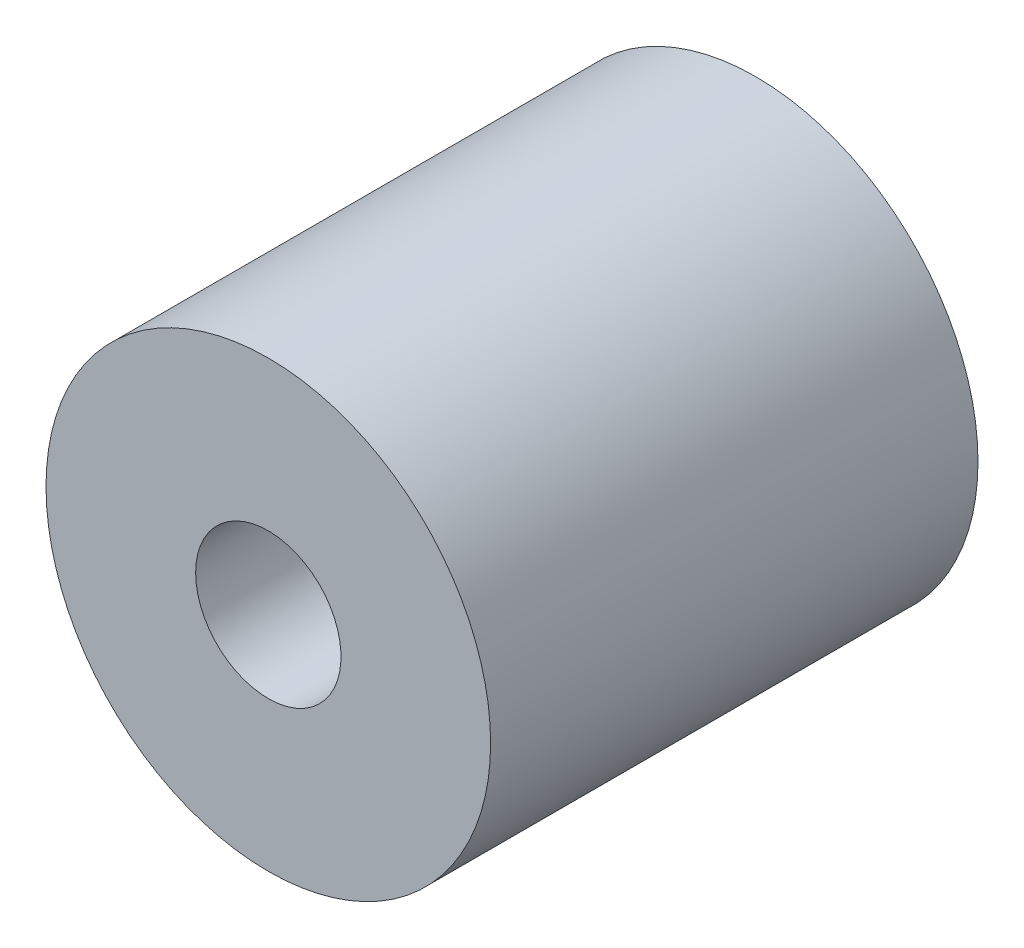
ISO-10303-21;
HEADER;
FILE_DESCRIPTION(('STEP AP214'),'2;1');
FILE_NAME('part.step','',(''),(''),'','','');
FILE_SCHEMA(('AUTOMOTIVE_DESIGN { 1 0 10303 214 1 1 1 1 }'));
ENDSEC;
DATA;
#1=APPLICATION_CONTEXT('core data for automotive mechanical design processes');
#2=APPLICATION_PROTOCOL_DEFINITION('international standard','automotive_design',2000,#1);
#3=PRODUCT_CONTEXT('',#1,'mechanical');
#4=PRODUCT('Part','Part','',(#3));
#5=PRODUCT_RELATED_PRODUCT_CATEGORY('part','',(#4));
#6=PRODUCT_DEFINITION_FORMATION('','',#4);
#7=PRODUCT_DEFINITION_CONTEXT('part definition',#1,'design');
#8=PRODUCT_DEFINITION('design','',#6,#7);
#9=PRODUCT_DEFINITION_SHAPE('','',#8);
#10=(LENGTH_UNIT() NAMED_UNIT(*) SI_UNIT(.MILLI.,.METRE.));
#11=(NAMED_UNIT(*) PLANE_ANGLE_UNIT() SI_UNIT($,.RADIAN.));
#12=(NAMED_UNIT(*) SI_UNIT($,.STERADIAN.) SOLID_ANGLE_UNIT());
#13=UNCERTAINTY_MEASURE_WITH_UNIT(LENGTH_MEASURE(1.E-05),#10,'distance_accuracy_value','');
#14=(GEOMETRIC_REPRESENTATION_CONTEXT(3) GLOBAL_UNCERTAINTY_ASSIGNED_CONTEXT((#13)) GLOBAL_UNIT_ASSIGNED_CONTEXT((#10,
#11,#12)) REPRESENTATION_CONTEXT('',''));
#15=CARTESIAN_POINT('',(0.,0.,0.));
#16=DIRECTION('',(0.,0.,1.));
#17=DIRECTION('',(1.,0.,0.));
#18=AXIS2_PLACEMENT_3D('',#15,#16,#17);
#19=CARTESIAN_POINT('',(0.,0.,57.));
#20=DIRECTION('',(0.,0.,1.));
#21=DIRECTION('',(1.,0.,0.));
#22=AXIS2_PLACEMENT_3D('',#19,#20,#21);
#23=PLANE('',#22);
#24=CARTESIAN_POINT('',(0.,0.,57.));
#25=DIRECTION('',(0.,0.,1.));
#26=DIRECTION('',(1.,0.,0.));
#27=AXIS2_PLACEMENT_3D('',#24,#25,#26);
#28=CIRCLE('',#27,26.);
#29=CARTESIAN_POINT('',(-26.,0.,57.));
#30=VERTEX_POINT('',#29);
#31=EDGE_CURVE('E10',#30,#30,#28,.T.);
#32=ORIENTED_EDGE('',*,*,#31,.T.);
#33=EDGE_LOOP('',(#32));
#34=FACE_BOUND('',#33,.T.);
#35=CARTESIAN_POINT('',(0.,0.,57.));
#36=DIRECTION('',(0.,0.,1.));
#37=DIRECTION('',(1.,0.,0.));
#38=AXIS2_PLACEMENT_3D('',#35,#36,#37);
#39=CIRCLE('',#38,8.5);
#40=CARTESIAN_POINT('',(-8.5,0.,57.));
#41=VERTEX_POINT('',#40);
#42=EDGE_CURVE('E42',#41,#41,#39,.T.);
#43=ORIENTED_EDGE('',*,*,#42,.F.);
#44=EDGE_LOOP('',(#43));
#45=FACE_BOUND('',#44,.T.);
#46=ADVANCED_FACE('F31',(#34,#45),#23,.T.);
#47=CARTESIAN_POINT('',(0.,0.,0.));
#48=DIRECTION('',(0.,0.,1.));
#49=DIRECTION('',(1.,0.,0.));
#50=AXIS2_PLACEMENT_3D('',#47,#48,#49);
#51=PLANE('',#50);
#52=CARTESIAN_POINT('',(0.,0.,0.));
#53=DIRECTION('',(0.,0.,1.));
#54=DIRECTION('',(1.,0.,0.));
#55=AXIS2_PLACEMENT_3D('',#52,#53,#54);
#56=CIRCLE('',#55,26.);
#57=CARTESIAN_POINT('',(-26.,0.,0.));
#58=VERTEX_POINT('',#57);
#59=EDGE_CURVE('E35',#58,#58,#56,.T.);
#60=ORIENTED_EDGE('',*,*,#59,.F.);
#61=EDGE_LOOP('',(#60));
#62=FACE_BOUND('',#61,.T.);
#63=CARTESIAN_POINT('',(0.,0.,0.));
#64=DIRECTION('',(0.,0.,1.));
#65=DIRECTION('',(1.,0.,0.));
#66=AXIS2_PLACEMENT_3D('',#63,#64,#65);
#67=CIRCLE('',#66,8.5);
#68=CARTESIAN_POINT('',(-8.5,0.,0.));
#69=VERTEX_POINT('',#68);
#70=EDGE_CURVE('E44',#69,#69,#67,.T.);
#71=ORIENTED_EDGE('',*,*,#70,.T.);
#72=EDGE_LOOP('',(#71));
#73=FACE_BOUND('',#72,.T.);
#74=ADVANCED_FACE('F54',(#62,#73),#51,.F.);
#75=CARTESIAN_POINT('',(0.,0.,57.));
#76=DIRECTION('',(0.,0.,-1.));
#77=DIRECTION('',(-1.,0.,0.));
#78=AXIS2_PLACEMENT_3D('',#75,#76,#77);
#79=CYLINDRICAL_SURFACE('',#78,26.);
#80=CARTESIAN_POINT('',(-26.,0.,57.));
#81=CARTESIAN_POINT('',(-26.,0.,56.40625));
#82=CARTESIAN_POINT('',(-26.,0.,55.8125));
#83=CARTESIAN_POINT('',(-26.,0.,54.625));
#84=CARTESIAN_POINT('',(-26.,0.,54.03125));
#85=CARTESIAN_POINT('',(-26.,0.,52.84375));
#86=CARTESIAN_POINT('',(-26.,0.,52.25));
#87=CARTESIAN_POINT('',(-26.,0.,51.0625));
#88=CARTESIAN_POINT('',(-26.,0.,50.46875));
#89=CARTESIAN_POINT('',(-26.,0.,49.28125));
#90=CARTESIAN_POINT('',(-26.,0.,48.6875));
#91=CARTESIAN_POINT('',(-26.,0.,47.5));
#92=CARTESIAN_POINT('',(-26.,0.,46.90625));
#93=CARTESIAN_POINT('',(-26.,0.,45.71875));
#94=CARTESIAN_POINT('',(-26.,0.,45.125));
#95=CARTESIAN_POINT('',(-26.,0.,43.9375));
#96=CARTESIAN_POINT('',(-26.,0.,43.34375));
#97=CARTESIAN_POINT('',(-26.,0.,42.15625));
#98=CARTESIAN_POINT('',(-26.,0.,41.5625));
#99=CARTESIAN_POINT('',(-26.,0.,40.375));
#100=CARTESIAN_POINT('',(-26.,0.,39.78125));
#101=CARTESIAN_POINT('',(-26.,0.,38.59375));
#102=CARTESIAN_POINT('',(-26.,0.,38.));
#103=CARTESIAN_POINT('',(-26.,0.,36.8125));
#104=CARTESIAN_POINT('',(-26.,0.,36.21875));
#105=CARTESIAN_POINT('',(-26.,0.,35.03125));
#106=CARTESIAN_POINT('',(-26.,0.,34.4375));
#107=CARTESIAN_POINT('',(-26.,0.,33.25));
#108=CARTESIAN_POINT('',(-26.,0.,32.65625));
#109=CARTESIAN_POINT('',(-26.,0.,31.46875));
#110=CARTESIAN_POINT('',(-26.,0.,30.875));
#111=CARTESIAN_POINT('',(-26.,0.,29.6875));
#112=CARTESIAN_POINT('',(-26.,0.,29.09375));
#113=CARTESIAN_POINT('',(-26.,0.,27.90625));
#114=CARTESIAN_POINT('',(-26.,0.,27.3125));
#115=CARTESIAN_POINT('',(-26.,0.,26.125));
#116=CARTESIAN_POINT('',(-26.,0.,25.53125));
#117=CARTESIAN_POINT('',(-26.,0.,24.34375));
#118=CARTESIAN_POINT('',(-26.,0.,23.75));
#119=CARTESIAN_POINT('',(-26.,0.,22.5625));
#120=CARTESIAN_POINT('',(-26.,0.,21.96875));
#121=CARTESIAN_POINT('',(-26.,0.,20.78125));
#122=CARTESIAN_POINT('',(-26.,0.,20.1875));
#123=CARTESIAN_POINT('',(-26.,0.,19.));
#124=CARTESIAN_POINT('',(-26.,0.,18.40625));
#125=CARTESIAN_POINT('',(-26.,0.,17.21875));
#126=CARTESIAN_POINT('',(-26.,0.,16.625));
#127=CARTESIAN_POINT('',(-26.,0.,15.4375));
#128=CARTESIAN_POINT('',(-26.,0.,14.84375));
#129=CARTESIAN_POINT('',(-26.,0.,13.65625));
#130=CARTESIAN_POINT('',(-26.,0.,13.0625));
#131=CARTESIAN_POINT('',(-26.,0.,11.875));
#132=CARTESIAN_POINT('',(-26.,0.,11.28125));
#133=CARTESIAN_POINT('',(-26.,0.,10.09375));
#134=CARTESIAN_POINT('',(-26.,0.,9.5));
#135=CARTESIAN_POINT('',(-26.,0.,8.3125));
#136=CARTESIAN_POINT('',(-26.,0.,7.71875));
#137=CARTESIAN_POINT('',(-26.,0.,6.53125));
#138=CARTESIAN_POINT('',(-26.,0.,5.9375));
#139=CARTESIAN_POINT('',(-26.,0.,4.75));
#140=CARTESIAN_POINT('',(-26.,0.,4.15625));
#141=CARTESIAN_POINT('',(-26.,0.,2.96875));
#142=CARTESIAN_POINT('',(-26.,0.,2.375));
#143=CARTESIAN_POINT('',(-26.,0.,1.1875));
#144=CARTESIAN_POINT('',(-26.,0.,0.593749999999999));
#145=CARTESIAN_POINT('',(-26.,0.,0.));
#146=B_SPLINE_CURVE_WITH_KNOTS('',3,(#80,#81,#82,#83,#84,#85,#86,#87,#88,#89,#90,#91,#92,#93,
#94,#95,#96,#97,#98,#99,#100,#101,#102,#103,#104,#105,#106,#107,#108,#109,#110,#111,#112,#113,
#114,#115,#116,#117,#118,#119,#120,#121,#122,#123,#124,#125,#126,#127,#128,#129,#130,#131,#132,
#133,#134,#135,#136,#137,#138,#139,#140,#141,#142,#143,#144,#145),.UNSPECIFIED.,.F.,.F.,(4,2,2,
2,2,2,2,2,2,2,2,2,2,2,2,2,2,2,2,2,2,2,2,2,2,2,2,2,2,2,2,2,4),(0.,1.78125,3.5625,
5.34374999999999,7.12499999999999,8.90625,10.6875,12.46875,14.25,16.03125,17.8125,19.59375,
21.375,23.15625,24.9375,26.71875,28.5,30.28125,32.0625,33.84375,35.625,37.40625,39.1875,
40.96875,42.75,44.53125,46.3125,48.09375,49.875,51.65625,53.4375,55.21875,57.),.UNSPECIFIED.);
#147=EDGE_CURVE('BSEAM33',#30,#58,#146,.T.);
#148=ORIENTED_EDGE('',*,*,#31,.F.);
#149=ORIENTED_EDGE('',*,*,#59,.T.);
#150=ORIENTED_EDGE('',*,*,#147,.T.);
#151=ORIENTED_EDGE('',*,*,#147,.F.);
#152=EDGE_LOOP('',(#148,#150,#149,#151));
#153=FACE_BOUND('',#152,.T.);
#154=ADVANCED_FACE('F33',(#153),#79,.T.);
#155=CARTESIAN_POINT('',(0.,0.,57.));
#156=DIRECTION('',(0.,0.,-1.));
#157=DIRECTION('',(-1.,0.,0.));
#158=AXIS2_PLACEMENT_3D('',#155,#156,#157);
#159=CYLINDRICAL_SURFACE('',#158,8.5);
#160=CARTESIAN_POINT('',(-8.5,0.,57.));
#161=CARTESIAN_POINT('',(-8.5,0.,56.40625));
#162=CARTESIAN_POINT('',(-8.5,0.,55.8125));
#163=CARTESIAN_POINT('',(-8.5,0.,54.625));
#164=CARTESIAN_POINT('',(-8.5,0.,54.03125));
#165=CARTESIAN_POINT('',(-8.5,0.,52.84375));
#166=CARTESIAN_POINT('',(-8.5,0.,52.25));
#167=CARTESIAN_POINT('',(-8.5,0.,51.0625));
#168=CARTESIAN_POINT('',(-8.5,0.,50.46875));
#169=CARTESIAN_POINT('',(-8.5,0.,49.28125));
#170=CARTESIAN_POINT('',(-8.5,0.,48.6875));
#171=CARTESIAN_POINT('',(-8.5,0.,47.5));
#172=CARTESIAN_POINT('',(-8.5,0.,46.90625));
#173=CARTESIAN_POINT('',(-8.5,0.,45.71875));
#174=CARTESIAN_POINT('',(-8.5,0.,45.125));
#175=CARTESIAN_POINT('',(-8.5,0.,43.9375));
#176=CARTESIAN_POINT('',(-8.5,0.,43.34375));
#177=CARTESIAN_POINT('',(-8.5,0.,42.15625));
#178=CARTESIAN_POINT('',(-8.5,0.,41.5625));
#179=CARTESIAN_POINT('',(-8.5,0.,40.375));
#180=CARTESIAN_POINT('',(-8.5,0.,39.78125));
#181=CARTESIAN_POINT('',(-8.5,0.,38.59375));
#182=CARTESIAN_POINT('',(-8.5,0.,38.));
#183=CARTESIAN_POINT('',(-8.5,0.,36.8125));
#184=CARTESIAN_POINT('',(-8.5,0.,36.21875));
#185=CARTESIAN_POINT('',(-8.5,0.,35.03125));
#186=CARTESIAN_POINT('',(-8.5,0.,34.4375));
#187=CARTESIAN_POINT('',(-8.5,0.,33.25));
#188=CARTESIAN_POINT('',(-8.5,0.,32.65625));
#189=CARTESIAN_POINT('',(-8.5,0.,31.46875));
#190=CARTESIAN_POINT('',(-8.5,0.,30.875));
#191=CARTESIAN_POINT('',(-8.5,0.,29.6875));
#192=CARTESIAN_POINT('',(-8.5,0.,29.09375));
#193=CARTESIAN_POINT('',(-8.5,0.,27.90625));
#194=CARTESIAN_POINT('',(-8.5,0.,27.3125));
#195=CARTESIAN_POINT('',(-8.5,0.,26.125));
#196=CARTESIAN_POINT('',(-8.5,0.,25.53125));
#197=CARTESIAN_POINT('',(-8.5,0.,24.34375));
#198=CARTESIAN_POINT('',(-8.5,0.,23.75));
#199=CARTESIAN_POINT('',(-8.5,0.,22.5625));
#200=CARTESIAN_POINT('',(-8.5,0.,21.96875));
#201=CARTESIAN_POINT('',(-8.5,0.,20.78125));
#202=CARTESIAN_POINT('',(-8.5,0.,20.1875));
#203=CARTESIAN_POINT('',(-8.5,0.,19.));
#204=CARTESIAN_POINT('',(-8.5,0.,18.40625));
#205=CARTESIAN_POINT('',(-8.5,0.,17.21875));
#206=CARTESIAN_POINT('',(-8.5,0.,16.625));
#207=CARTESIAN_POINT('',(-8.5,0.,15.4375));
#208=CARTESIAN_POINT('',(-8.5,0.,14.84375));
#209=CARTESIAN_POINT('',(-8.5,0.,13.65625));
#210=CARTESIAN_POINT('',(-8.5,0.,13.0625));
#211=CARTESIAN_POINT('',(-8.5,0.,11.875));
#212=CARTESIAN_POINT('',(-8.5,0.,11.28125));
#213=CARTESIAN_POINT('',(-8.5,0.,10.09375));
#214=CARTESIAN_POINT('',(-8.5,0.,9.5));
#215=CARTESIAN_POINT('',(-8.5,0.,8.3125));
#216=CARTESIAN_POINT('',(-8.5,0.,7.71875));
#217=CARTESIAN_POINT('',(-8.5,0.,6.53125));
#218=CARTESIAN_POINT('',(-8.5,0.,5.9375));
#219=CARTESIAN_POINT('',(-8.5,0.,4.75));
#220=CARTESIAN_POINT('',(-8.5,0.,4.15625));
#221=CARTESIAN_POINT('',(-8.5,0.,2.96875));
#222=CARTESIAN_POINT('',(-8.5,0.,2.375));
#223=CARTESIAN_POINT('',(-8.5,0.,1.1875));
#224=CARTESIAN_POINT('',(-8.5,0.,0.593749999999999));
#225=CARTESIAN_POINT('',(-8.5,0.,0.));
#226=B_SPLINE_CURVE_WITH_KNOTS('',3,(#160,#161,#162,#163,#164,#165,#166,#167,#168,#169,#170,
#171,#172,#173,#174,#175,#176,#177,#178,#179,#180,#181,#182,#183,#184,#185,#186,#187,#188,#189,
#190,#191,#192,#193,#194,#195,#196,#197,#198,#199,#200,#201,#202,#203,#204,#205,#206,#207,#208,
#209,#210,#211,#212,#213,#214,#215,#216,#217,#218,#219,#220,#221,#222,#223,#224,#225),
.UNSPECIFIED.,.F.,.F.,(4,2,2,2,2,2,2,2,2,2,2,2,2,2,2,2,2,2,2,2,2,2,2,2,2,2,2,2,2,2,2,2,4),(0.,
1.78125,3.5625,5.34374999999999,7.12499999999999,8.90625,10.6875,12.46875,14.25,16.03125,
17.8125,19.59375,21.375,23.15625,24.9375,26.71875,28.5,30.28125,32.0625,33.84375,35.625,
37.40625,39.1875,40.96875,42.75,44.53125,46.3125,48.09375,49.875,51.65625,53.4375,55.21875,57.),.UNSPECIFIED.);
#227=EDGE_CURVE('BSEAM50',#41,#69,#226,.T.);
#228=ORIENTED_EDGE('',*,*,#42,.T.);
#229=ORIENTED_EDGE('',*,*,#70,.F.);
#230=ORIENTED_EDGE('',*,*,#227,.T.);
#231=ORIENTED_EDGE('',*,*,#227,.F.);
#232=EDGE_LOOP('',(#228,#230,#229,#231));
#233=FACE_BOUND('',#232,.T.);
#234=ADVANCED_FACE('F50',(#233),#159,.F.);
#235=CLOSED_SHELL('',(#46,#74,#154,#234));
#236=MANIFOLD_SOLID_BREP('B2',#235);
#237=ADVANCED_BREP_SHAPE_REPRESENTATION('',(#18,#236),#14);
#238=SHAPE_DEFINITION_REPRESENTATION(#9,#237);
ENDSEC;
END-ISO-10303-21;
